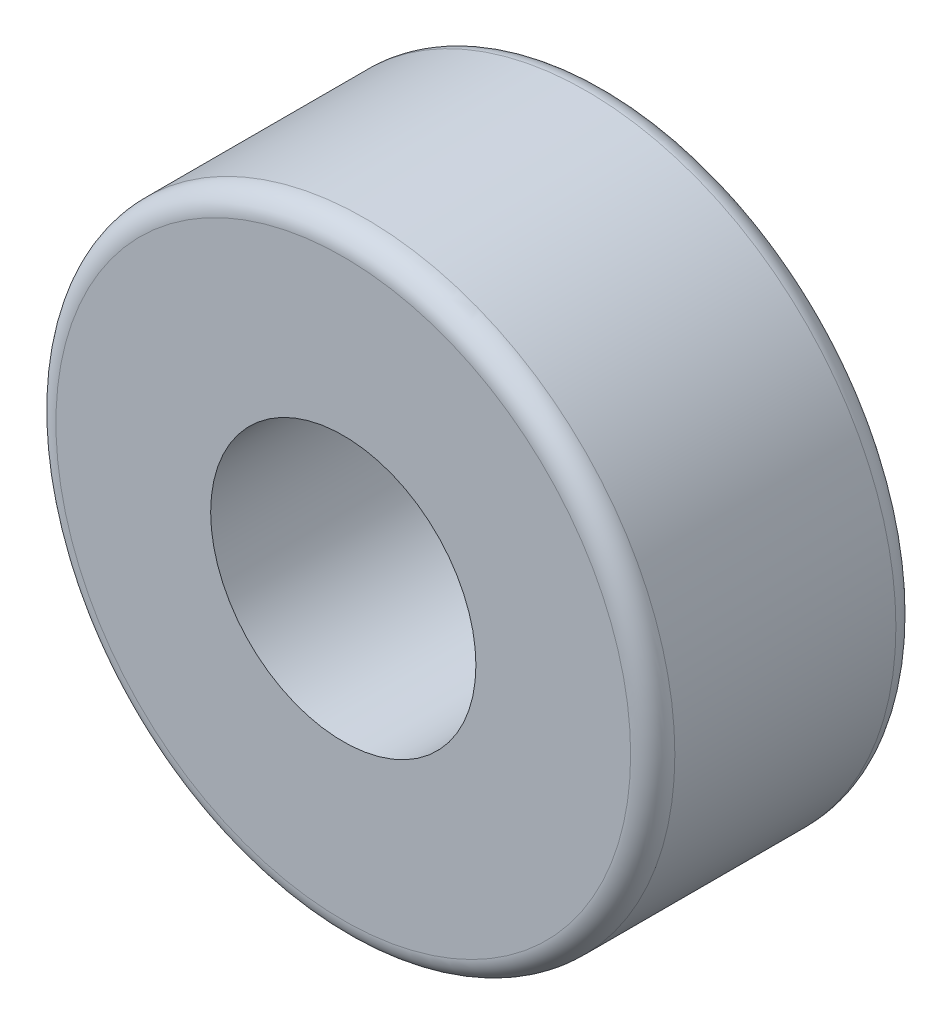
ISO-10303-21;
HEADER;
FILE_DESCRIPTION(('STEP AP214'),'2;1');
FILE_NAME('part.step','',(''),(''),'','','');
FILE_SCHEMA(('AUTOMOTIVE_DESIGN { 1 0 10303 214 1 1 1 1 }'));
ENDSEC;
DATA;
#1=APPLICATION_CONTEXT('core data for automotive mechanical design processes');
#2=APPLICATION_PROTOCOL_DEFINITION('international standard','automotive_design',2000,#1);
#3=PRODUCT_CONTEXT('',#1,'mechanical');
#4=PRODUCT('Part','Part','',(#3));
#5=PRODUCT_RELATED_PRODUCT_CATEGORY('part','',(#4));
#6=PRODUCT_DEFINITION_FORMATION('','',#4);
#7=PRODUCT_DEFINITION_CONTEXT('part definition',#1,'design');
#8=PRODUCT_DEFINITION('design','',#6,#7);
#9=PRODUCT_DEFINITION_SHAPE('','',#8);
#10=(LENGTH_UNIT() NAMED_UNIT(*) SI_UNIT(.MILLI.,.METRE.));
#11=(NAMED_UNIT(*) PLANE_ANGLE_UNIT() SI_UNIT($,.RADIAN.));
#12=(NAMED_UNIT(*) SI_UNIT($,.STERADIAN.) SOLID_ANGLE_UNIT());
#13=UNCERTAINTY_MEASURE_WITH_UNIT(LENGTH_MEASURE(1.E-05),#10,'distance_accuracy_value','');
#14=(GEOMETRIC_REPRESENTATION_CONTEXT(3) GLOBAL_UNCERTAINTY_ASSIGNED_CONTEXT((#13)) GLOBAL_UNIT_ASSIGNED_CONTEXT((#10,
#11,#12)) REPRESENTATION_CONTEXT('',''));
#15=CARTESIAN_POINT('',(0.,0.,0.));
#16=DIRECTION('',(0.,0.,1.));
#17=DIRECTION('',(1.,0.,0.));
#18=AXIS2_PLACEMENT_3D('',#15,#16,#17);
#19=CARTESIAN_POINT('',(0.,0.2911001278251,6.));
#20=DIRECTION('',(0.,0.,1.));
#21=DIRECTION('',(1.,0.,0.));
#22=AXIS2_PLACEMENT_3D('',#19,#20,#21);
#23=PLANE('',#22);
#24=CARTESIAN_POINT('',(0.,0.2911001278251,6.));
#25=DIRECTION('',(0.,0.,1.));
#26=DIRECTION('',(1.,0.,0.));
#27=AXIS2_PLACEMENT_3D('',#24,#25,#26);
#28=CIRCLE('',#27,6.5);
#29=CARTESIAN_POINT('',(6.5,0.2911001278251,6.));
#30=VERTEX_POINT('',#29);
#31=EDGE_CURVE('E10',#30,#30,#28,.T.);
#32=ORIENTED_EDGE('',*,*,#31,.T.);
#33=EDGE_LOOP('',(#32));
#34=FACE_BOUND('',#33,.T.);
#35=CARTESIAN_POINT('',(0.,0.2911001278251,6.));
#36=DIRECTION('',(0.,0.,1.));
#37=DIRECTION('',(1.,0.,0.));
#38=AXIS2_PLACEMENT_3D('',#35,#36,#37);
#39=CIRCLE('',#38,3.);
#40=CARTESIAN_POINT('',(3.,0.2911001278251,6.));
#41=VERTEX_POINT('',#40);
#42=EDGE_CURVE('E52',#41,#41,#39,.T.);
#43=ORIENTED_EDGE('',*,*,#42,.F.);
#44=EDGE_LOOP('',(#43));
#45=FACE_BOUND('',#44,.T.);
#46=ADVANCED_FACE('F32',(#34,#45),#23,.T.);
#47=CARTESIAN_POINT('',(0.,0.2911001278251,0.));
#48=DIRECTION('',(0.,0.,1.));
#49=DIRECTION('',(1.,0.,0.));
#50=AXIS2_PLACEMENT_3D('',#47,#48,#49);
#51=PLANE('',#50);
#52=CARTESIAN_POINT('',(0.,0.2911001278251,0.));
#53=DIRECTION('',(0.,0.,1.));
#54=DIRECTION('',(1.,0.,0.));
#55=AXIS2_PLACEMENT_3D('',#52,#53,#54);
#56=CIRCLE('',#55,6.5);
#57=CARTESIAN_POINT('',(6.5,0.2911001278251,0.));
#58=VERTEX_POINT('',#57);
#59=EDGE_CURVE('E39',#58,#58,#56,.F.);
#60=ORIENTED_EDGE('',*,*,#59,.T.);
#61=EDGE_LOOP('',(#60));
#62=FACE_BOUND('',#61,.T.);
#63=CARTESIAN_POINT('',(0.,0.2911001278251,0.));
#64=DIRECTION('',(0.,0.,1.));
#65=DIRECTION('',(1.,0.,0.));
#66=AXIS2_PLACEMENT_3D('',#63,#64,#65);
#67=CIRCLE('',#66,3.);
#68=CARTESIAN_POINT('',(3.,0.2911001278251,0.));
#69=VERTEX_POINT('',#68);
#70=EDGE_CURVE('E53',#69,#69,#67,.T.);
#71=ORIENTED_EDGE('',*,*,#70,.T.);
#72=EDGE_LOOP('',(#71));
#73=FACE_BOUND('',#72,.T.);
#74=ADVANCED_FACE('F63',(#62,#73),#51,.F.);
#75=CARTESIAN_POINT('',(0.,0.2911001278251,6.));
#76=DIRECTION('',(0.,0.,-1.));
#77=DIRECTION('',(-1.,0.,0.));
#78=AXIS2_PLACEMENT_3D('',#75,#76,#77);
#79=CYLINDRICAL_SURFACE('',#78,7.);
#80=CARTESIAN_POINT('',(0.,0.2911001278251,0.5));
#81=DIRECTION('',(0.,0.,1.));
#82=DIRECTION('',(1.,0.,0.));
#83=AXIS2_PLACEMENT_3D('',#80,#81,#82);
#84=CIRCLE('',#83,7.);
#85=CARTESIAN_POINT('',(7.,0.2911001278251,0.5));
#86=VERTEX_POINT('',#85);
#87=EDGE_CURVE('E43',#86,#86,#84,.T.);
#88=ORIENTED_EDGE('',*,*,#87,.T.);
#89=EDGE_LOOP('',(#88));
#90=FACE_BOUND('',#89,.T.);
#91=CARTESIAN_POINT('',(0.,0.2911001278251,5.5));
#92=DIRECTION('',(0.,0.,1.));
#93=DIRECTION('',(1.,0.,0.));
#94=AXIS2_PLACEMENT_3D('',#91,#92,#93);
#95=CIRCLE('',#94,7.);
#96=CARTESIAN_POINT('',(7.,0.2911001278251,5.5));
#97=VERTEX_POINT('',#96);
#98=EDGE_CURVE('E47',#97,#97,#95,.F.);
#99=ORIENTED_EDGE('',*,*,#98,.T.);
#100=EDGE_LOOP('',(#99));
#101=FACE_BOUND('',#100,.T.);
#102=ADVANCED_FACE('F68',(#90,#101),#79,.T.);
#103=CARTESIAN_POINT('',(0.,0.2911001278251,6.));
#104=DIRECTION('',(0.,0.,-1.));
#105=DIRECTION('',(-1.,0.,0.));
#106=AXIS2_PLACEMENT_3D('',#103,#104,#105);
#107=CYLINDRICAL_SURFACE('',#106,3.);
#108=ORIENTED_EDGE('',*,*,#42,.T.);
#109=EDGE_LOOP('',(#108));
#110=FACE_BOUND('',#109,.T.);
#111=ORIENTED_EDGE('',*,*,#70,.F.);
#112=EDGE_LOOP('',(#111));
#113=FACE_BOUND('',#112,.T.);
#114=ADVANCED_FACE('F59',(#110,#113),#107,.F.);
#115=CARTESIAN_POINT('',(0.,0.2911001278251,0.5));
#116=DIRECTION('',(0.,0.,1.));
#117=DIRECTION('',(1.,0.,0.));
#118=AXIS2_PLACEMENT_3D('',#115,#116,#117);
#119=TOROIDAL_SURFACE('',#118,6.5,0.5);
#120=ORIENTED_EDGE('',*,*,#59,.F.);
#121=EDGE_LOOP('',(#120));
#122=FACE_BOUND('',#121,.T.);
#123=ORIENTED_EDGE('',*,*,#87,.F.);
#124=EDGE_LOOP('',(#123));
#125=FACE_BOUND('',#124,.T.);
#126=ADVANCED_FACE('F74',(#122,#125),#119,.T.);
#127=CARTESIAN_POINT('',(0.,0.2911001278251,5.5));
#128=DIRECTION('',(0.,0.,1.));
#129=DIRECTION('',(1.,0.,0.));
#130=AXIS2_PLACEMENT_3D('',#127,#128,#129);
#131=TOROIDAL_SURFACE('',#130,6.5,0.5);
#132=ORIENTED_EDGE('',*,*,#98,.F.);
#133=EDGE_LOOP('',(#132));
#134=FACE_BOUND('',#133,.T.);
#135=ORIENTED_EDGE('',*,*,#31,.F.);
#136=EDGE_LOOP('',(#135));
#137=FACE_BOUND('',#136,.T.);
#138=ADVANCED_FACE('F34',(#134,#137),#131,.T.);
#139=CLOSED_SHELL('',(#46,#74,#102,#114,#126,#138));
#140=MANIFOLD_SOLID_BREP('B2',#139);
#141=ADVANCED_BREP_SHAPE_REPRESENTATION('',(#18,#140),#14);
#142=SHAPE_DEFINITION_REPRESENTATION(#9,#141);
ENDSEC;
END-ISO-10303-21;
